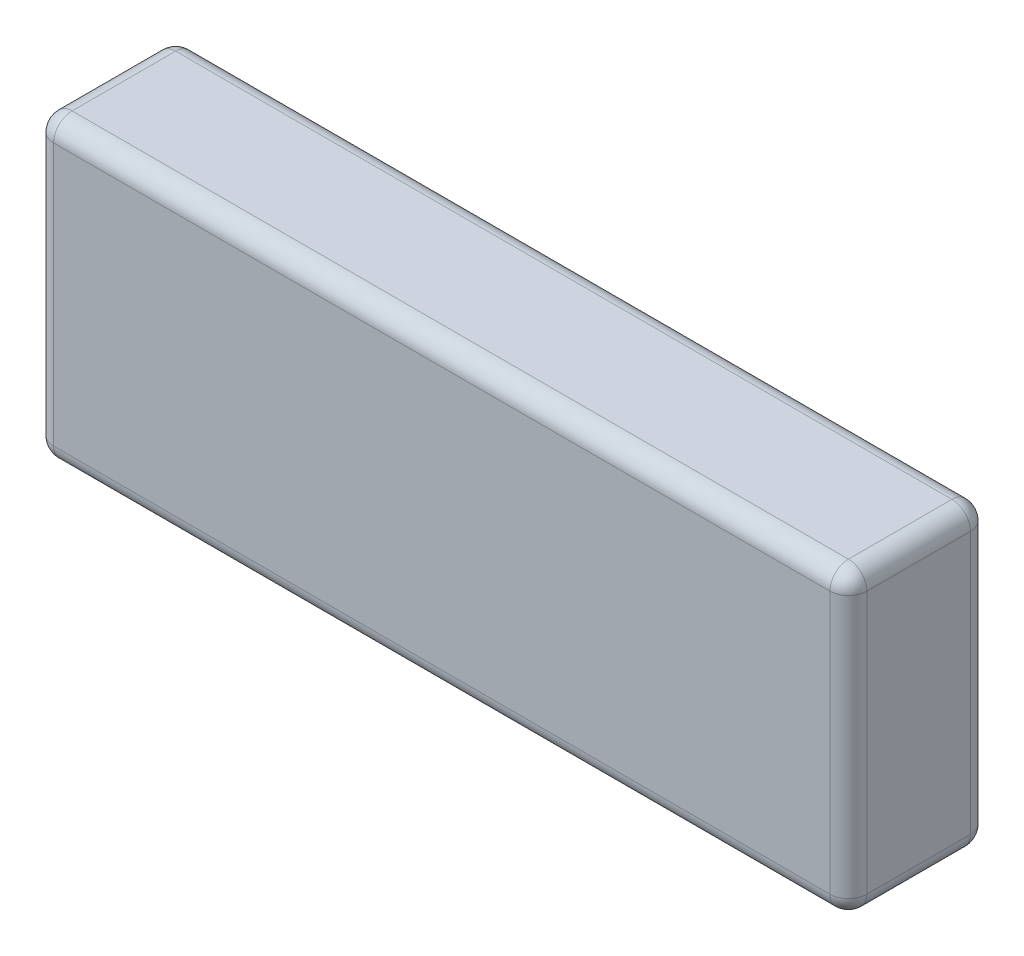
ISO-10303-21;
HEADER;
FILE_DESCRIPTION(('STEP AP214'),'2;1');
FILE_NAME('part.step','',(''),(''),'','','');
FILE_SCHEMA(('AUTOMOTIVE_DESIGN { 1 0 10303 214 1 1 1 1 }'));
ENDSEC;
DATA;
#1=APPLICATION_CONTEXT('core data for automotive mechanical design processes');
#2=APPLICATION_PROTOCOL_DEFINITION('international standard','automotive_design',2000,#1);
#3=PRODUCT_CONTEXT('',#1,'mechanical');
#4=PRODUCT('Part','Part','',(#3));
#5=PRODUCT_RELATED_PRODUCT_CATEGORY('part','',(#4));
#6=PRODUCT_DEFINITION_FORMATION('','',#4);
#7=PRODUCT_DEFINITION_CONTEXT('part definition',#1,'design');
#8=PRODUCT_DEFINITION('design','',#6,#7);
#9=PRODUCT_DEFINITION_SHAPE('','',#8);
#10=(LENGTH_UNIT() NAMED_UNIT(*) SI_UNIT(.MILLI.,.METRE.));
#11=(NAMED_UNIT(*) PLANE_ANGLE_UNIT() SI_UNIT($,.RADIAN.));
#12=(NAMED_UNIT(*) SI_UNIT($,.STERADIAN.) SOLID_ANGLE_UNIT());
#13=UNCERTAINTY_MEASURE_WITH_UNIT(LENGTH_MEASURE(1.E-05),#10,'distance_accuracy_value','');
#14=(GEOMETRIC_REPRESENTATION_CONTEXT(3) GLOBAL_UNCERTAINTY_ASSIGNED_CONTEXT((#13)) GLOBAL_UNIT_ASSIGNED_CONTEXT((#10,
#11,#12)) REPRESENTATION_CONTEXT('',''));
#15=CARTESIAN_POINT('',(0.,0.,0.));
#16=DIRECTION('',(0.,0.,1.));
#17=DIRECTION('',(1.,0.,0.));
#18=AXIS2_PLACEMENT_3D('',#15,#16,#17);
#19=CARTESIAN_POINT('',(0.,0.,3.8));
#20=DIRECTION('',(1.,0.,0.));
#21=DIRECTION('',(0.,0.,-1.));
#22=AXIS2_PLACEMENT_3D('',#19,#20,#21);
#23=PLANE('',#22);
#24=DIRECTION('',(0.,-1.,0.));
#25=VECTOR('',#24,1.);
#26=CARTESIAN_POINT('',(0.,0.,0.5));
#27=LINE('',#26,#25);
#28=CARTESIAN_POINT('',(0.,7.6,0.5));
#29=VERTEX_POINT('',#28);
#30=CARTESIAN_POINT('',(0.,0.5,0.5));
#31=VERTEX_POINT('',#30);
#32=EDGE_CURVE('E167',#29,#31,#27,.T.);
#33=ORIENTED_EDGE('',*,*,#32,.T.);
#34=DIRECTION('',(0.,0.,-1.));
#35=VECTOR('',#34,1.);
#36=CARTESIAN_POINT('',(0.,0.5,3.8));
#37=LINE('',#36,#35);
#38=CARTESIAN_POINT('',(0.,0.5,3.3));
#39=VERTEX_POINT('',#38);
#40=EDGE_CURVE('E169',#31,#39,#37,.F.);
#41=ORIENTED_EDGE('',*,*,#40,.T.);
#42=DIRECTION('',(0.,-1.,0.));
#43=VECTOR('',#42,1.);
#44=CARTESIAN_POINT('',(0.,0.,3.3));
#45=LINE('',#44,#43);
#46=CARTESIAN_POINT('',(0.,7.6,3.3));
#47=VERTEX_POINT('',#46);
#48=EDGE_CURVE('E163',#39,#47,#45,.F.);
#49=ORIENTED_EDGE('',*,*,#48,.T.);
#50=DIRECTION('',(0.,0.,-1.));
#51=VECTOR('',#50,1.);
#52=CARTESIAN_POINT('',(0.,7.6,3.8));
#53=LINE('',#52,#51);
#54=EDGE_CURVE('E165',#47,#29,#53,.T.);
#55=ORIENTED_EDGE('',*,*,#54,.T.);
#56=EDGE_LOOP('',(#33,#41,#49,#55));
#57=FACE_BOUND('',#56,.T.);
#58=ADVANCED_FACE('F32',(#57),#23,.F.);
#59=CARTESIAN_POINT('',(0.,0.,3.8));
#60=DIRECTION('',(0.,1.,0.));
#61=DIRECTION('',(0.,0.,1.));
#62=AXIS2_PLACEMENT_3D('',#59,#60,#61);
#63=PLANE('',#62);
#64=DIRECTION('',(1.,0.,0.));
#65=VECTOR('',#64,1.);
#66=CARTESIAN_POINT('',(0.,0.,3.3));
#67=LINE('',#66,#65);
#68=CARTESIAN_POINT('',(21.5,0.,3.3));
#69=VERTEX_POINT('',#68);
#70=CARTESIAN_POINT('',(0.5,0.,3.3));
#71=VERTEX_POINT('',#70);
#72=EDGE_CURVE('E124',#69,#71,#67,.F.);
#73=ORIENTED_EDGE('',*,*,#72,.T.);
#74=DIRECTION('',(0.,0.,-1.));
#75=VECTOR('',#74,1.);
#76=CARTESIAN_POINT('',(0.5,0.,3.8));
#77=LINE('',#76,#75);
#78=CARTESIAN_POINT('',(0.5,0.,0.5));
#79=VERTEX_POINT('',#78);
#80=EDGE_CURVE('E161',#71,#79,#77,.T.);
#81=ORIENTED_EDGE('',*,*,#80,.T.);
#82=DIRECTION('',(1.,0.,0.));
#83=VECTOR('',#82,1.);
#84=CARTESIAN_POINT('',(22.,0.,0.5));
#85=LINE('',#84,#83);
#86=CARTESIAN_POINT('',(21.5,0.,0.5));
#87=VERTEX_POINT('',#86);
#88=EDGE_CURVE('E127',#79,#87,#85,.T.);
#89=ORIENTED_EDGE('',*,*,#88,.T.);
#90=DIRECTION('',(0.,0.,-1.));
#91=VECTOR('',#90,1.);
#92=CARTESIAN_POINT('',(21.5,0.,3.8));
#93=LINE('',#92,#91);
#94=EDGE_CURVE('E119',#87,#69,#93,.F.);
#95=ORIENTED_EDGE('',*,*,#94,.T.);
#96=EDGE_LOOP('',(#73,#81,#89,#95));
#97=FACE_BOUND('',#96,.T.);
#98=ADVANCED_FACE('F121',(#97),#63,.F.);
#99=CARTESIAN_POINT('',(22.,0.,3.8));
#100=DIRECTION('',(-1.,0.,0.));
#101=DIRECTION('',(0.,0.,1.));
#102=AXIS2_PLACEMENT_3D('',#99,#100,#101);
#103=PLANE('',#102);
#104=DIRECTION('',(0.,1.,0.));
#105=VECTOR('',#104,1.);
#106=CARTESIAN_POINT('',(22.,0.,3.3));
#107=LINE('',#106,#105);
#108=CARTESIAN_POINT('',(22.,7.6,3.3));
#109=VERTEX_POINT('',#108);
#110=CARTESIAN_POINT('',(22.,0.5,3.3));
#111=VERTEX_POINT('',#110);
#112=EDGE_CURVE('E181',#109,#111,#107,.F.);
#113=ORIENTED_EDGE('',*,*,#112,.T.);
#114=DIRECTION('',(0.,0.,-1.));
#115=VECTOR('',#114,1.);
#116=CARTESIAN_POINT('',(22.,0.5,3.8));
#117=LINE('',#116,#115);
#118=CARTESIAN_POINT('',(22.,0.5,0.5));
#119=VERTEX_POINT('',#118);
#120=EDGE_CURVE('E138',#111,#119,#117,.T.);
#121=ORIENTED_EDGE('',*,*,#120,.T.);
#122=DIRECTION('',(0.,1.,0.));
#123=VECTOR('',#122,1.);
#124=CARTESIAN_POINT('',(22.,8.1,0.5));
#125=LINE('',#124,#123);
#126=CARTESIAN_POINT('',(22.,7.6,0.5));
#127=VERTEX_POINT('',#126);
#128=EDGE_CURVE('E185',#119,#127,#125,.T.);
#129=ORIENTED_EDGE('',*,*,#128,.T.);
#130=DIRECTION('',(0.,0.,-1.));
#131=VECTOR('',#130,1.);
#132=CARTESIAN_POINT('',(22.,7.6,3.8));
#133=LINE('',#132,#131);
#134=EDGE_CURVE('E183',#127,#109,#133,.F.);
#135=ORIENTED_EDGE('',*,*,#134,.T.);
#136=EDGE_LOOP('',(#113,#121,#129,#135));
#137=FACE_BOUND('',#136,.T.);
#138=ADVANCED_FACE('F323',(#137),#103,.F.);
#139=CARTESIAN_POINT('',(0.,8.1,3.8));
#140=DIRECTION('',(0.,-1.,0.));
#141=DIRECTION('',(0.,0.,-1.));
#142=AXIS2_PLACEMENT_3D('',#139,#140,#141);
#143=PLANE('',#142);
#144=DIRECTION('',(0.,0.,-1.));
#145=VECTOR('',#144,1.);
#146=CARTESIAN_POINT('',(21.5,8.1,3.8));
#147=LINE('',#146,#145);
#148=CARTESIAN_POINT('',(21.5,8.1,3.3));
#149=VERTEX_POINT('',#148);
#150=CARTESIAN_POINT('',(21.5,8.1,0.5));
#151=VERTEX_POINT('',#150);
#152=EDGE_CURVE('E192',#149,#151,#147,.T.);
#153=ORIENTED_EDGE('',*,*,#152,.T.);
#154=DIRECTION('',(-1.,0.,0.));
#155=VECTOR('',#154,1.);
#156=CARTESIAN_POINT('',(0.,8.1,0.5));
#157=LINE('',#156,#155);
#158=CARTESIAN_POINT('',(0.5,8.1,0.5));
#159=VERTEX_POINT('',#158);
#160=EDGE_CURVE('E195',#151,#159,#157,.T.);
#161=ORIENTED_EDGE('',*,*,#160,.T.);
#162=DIRECTION('',(0.,0.,-1.));
#163=VECTOR('',#162,1.);
#164=CARTESIAN_POINT('',(0.5,8.1,3.8));
#165=LINE('',#164,#163);
#166=CARTESIAN_POINT('',(0.5,8.1,3.3));
#167=VERTEX_POINT('',#166);
#168=EDGE_CURVE('E190',#159,#167,#165,.F.);
#169=ORIENTED_EDGE('',*,*,#168,.T.);
#170=DIRECTION('',(-1.,0.,0.));
#171=VECTOR('',#170,1.);
#172=CARTESIAN_POINT('',(0.,8.1,3.3));
#173=LINE('',#172,#171);
#174=EDGE_CURVE('E188',#167,#149,#173,.F.);
#175=ORIENTED_EDGE('',*,*,#174,.T.);
#176=EDGE_LOOP('',(#153,#161,#169,#175));
#177=FACE_BOUND('',#176,.T.);
#178=ADVANCED_FACE('F272',(#177),#143,.F.);
#179=CARTESIAN_POINT('',(0.,0.,3.8));
#180=DIRECTION('',(0.,0.,-1.));
#181=DIRECTION('',(-1.,0.,0.));
#182=AXIS2_PLACEMENT_3D('',#179,#180,#181);
#183=PLANE('',#182);
#184=DIRECTION('',(0.,1.,0.));
#185=VECTOR('',#184,1.);
#186=CARTESIAN_POINT('',(21.5,0.,3.8));
#187=LINE('',#186,#185);
#188=CARTESIAN_POINT('',(21.5,0.5,3.8));
#189=VERTEX_POINT('',#188);
#190=CARTESIAN_POINT('',(21.5,7.6,3.8));
#191=VERTEX_POINT('',#190);
#192=EDGE_CURVE('E41',#189,#191,#187,.T.);
#193=ORIENTED_EDGE('',*,*,#192,.T.);
#194=DIRECTION('',(-1.,0.,0.));
#195=VECTOR('',#194,1.);
#196=CARTESIAN_POINT('',(0.,7.6,3.8));
#197=LINE('',#196,#195);
#198=CARTESIAN_POINT('',(0.5,7.6,3.8));
#199=VERTEX_POINT('',#198);
#200=EDGE_CURVE('E11',#191,#199,#197,.T.);
#201=ORIENTED_EDGE('',*,*,#200,.T.);
#202=DIRECTION('',(0.,-1.,0.));
#203=VECTOR('',#202,1.);
#204=CARTESIAN_POINT('',(0.5,0.,3.8));
#205=LINE('',#204,#203);
#206=CARTESIAN_POINT('',(0.5,0.5,3.8));
#207=VERTEX_POINT('',#206);
#208=EDGE_CURVE('E197',#199,#207,#205,.T.);
#209=ORIENTED_EDGE('',*,*,#208,.T.);
#210=DIRECTION('',(1.,0.,0.));
#211=VECTOR('',#210,1.);
#212=CARTESIAN_POINT('',(0.,0.5,3.8));
#213=LINE('',#212,#211);
#214=EDGE_CURVE('E52',#207,#189,#213,.T.);
#215=ORIENTED_EDGE('',*,*,#214,.T.);
#216=EDGE_LOOP('',(#193,#201,#209,#215));
#217=FACE_BOUND('',#216,.T.);
#218=ADVANCED_FACE('F287',(#217),#183,.F.);
#219=CARTESIAN_POINT('',(0.,0.,0.));
#220=DIRECTION('',(0.,0.,-1.));
#221=DIRECTION('',(-1.,0.,0.));
#222=AXIS2_PLACEMENT_3D('',#219,#220,#221);
#223=PLANE('',#222);
#224=DIRECTION('',(0.,1.,0.));
#225=VECTOR('',#224,1.);
#226=CARTESIAN_POINT('',(21.5,0.,0.));
#227=LINE('',#226,#225);
#228=CARTESIAN_POINT('',(21.5,7.6,0.));
#229=VERTEX_POINT('',#228);
#230=CARTESIAN_POINT('',(21.5,0.5,0.));
#231=VERTEX_POINT('',#230);
#232=EDGE_CURVE('E174',#229,#231,#227,.F.);
#233=ORIENTED_EDGE('',*,*,#232,.T.);
#234=DIRECTION('',(1.,0.,0.));
#235=VECTOR('',#234,1.);
#236=CARTESIAN_POINT('',(0.,0.5,0.));
#237=LINE('',#236,#235);
#238=CARTESIAN_POINT('',(0.5,0.5,0.));
#239=VERTEX_POINT('',#238);
#240=EDGE_CURVE('E178',#231,#239,#237,.F.);
#241=ORIENTED_EDGE('',*,*,#240,.T.);
#242=DIRECTION('',(0.,-1.,0.));
#243=VECTOR('',#242,1.);
#244=CARTESIAN_POINT('',(0.5,8.1,0.));
#245=LINE('',#244,#243);
#246=CARTESIAN_POINT('',(0.5,7.6,0.));
#247=VERTEX_POINT('',#246);
#248=EDGE_CURVE('E176',#239,#247,#245,.F.);
#249=ORIENTED_EDGE('',*,*,#248,.T.);
#250=DIRECTION('',(-1.,0.,0.));
#251=VECTOR('',#250,1.);
#252=CARTESIAN_POINT('',(22.,7.6,0.));
#253=LINE('',#252,#251);
#254=EDGE_CURVE('E172',#247,#229,#253,.F.);
#255=ORIENTED_EDGE('',*,*,#254,.T.);
#256=EDGE_LOOP('',(#233,#241,#249,#255));
#257=FACE_BOUND('',#256,.T.);
#258=ADVANCED_FACE('F263',(#257),#223,.T.);
#259=CARTESIAN_POINT('',(21.5,7.6,3.8));
#260=DIRECTION('',(0.,0.,-1.));
#261=DIRECTION('',(-1.,0.,0.));
#262=AXIS2_PLACEMENT_3D('',#259,#260,#261);
#263=CYLINDRICAL_SURFACE('',#262,0.5);
#264=CARTESIAN_POINT('',(21.5,7.6,3.3));
#265=DIRECTION('',(0.,0.,1.));
#266=DIRECTION('',(1.,0.,0.));
#267=AXIS2_PLACEMENT_3D('',#264,#265,#266);
#268=CIRCLE('',#267,0.5);
#269=EDGE_CURVE('E36',#109,#149,#268,.T.);
#270=ORIENTED_EDGE('',*,*,#269,.F.);
#271=ORIENTED_EDGE('',*,*,#134,.F.);
#272=CARTESIAN_POINT('',(21.5,7.6,0.5));
#273=DIRECTION('',(0.,0.,-1.));
#274=DIRECTION('',(-1.,0.,0.));
#275=AXIS2_PLACEMENT_3D('',#272,#273,#274);
#276=CIRCLE('',#275,0.5);
#277=EDGE_CURVE('E158',#151,#127,#276,.T.);
#278=ORIENTED_EDGE('',*,*,#277,.F.);
#279=ORIENTED_EDGE('',*,*,#152,.F.);
#280=EDGE_LOOP('',(#270,#271,#278,#279));
#281=FACE_BOUND('',#280,.T.);
#282=ADVANCED_FACE('F34',(#281),#263,.T.);
#283=CARTESIAN_POINT('',(21.5,7.6,3.3));
#284=DIRECTION('',(0.,0.,1.));
#285=DIRECTION('',(1.,0.,0.));
#286=AXIS2_PLACEMENT_3D('',#283,#284,#285);
#287=SPHERICAL_SURFACE('',#286,0.5);
#288=CARTESIAN_POINT('',(21.5,7.6,3.3));
#289=DIRECTION('',(0.,1.,0.));
#290=DIRECTION('',(0.,0.,1.));
#291=AXIS2_PLACEMENT_3D('',#288,#289,#290);
#292=CIRCLE('',#291,0.5);
#293=EDGE_CURVE('E243',#109,#191,#292,.F.);
#294=ORIENTED_EDGE('',*,*,#293,.F.);
#295=ORIENTED_EDGE('',*,*,#269,.T.);
#296=CARTESIAN_POINT('',(21.5,7.6,3.3));
#297=DIRECTION('',(1.,0.,0.));
#298=DIRECTION('',(0.,0.,-1.));
#299=AXIS2_PLACEMENT_3D('',#296,#297,#298);
#300=CIRCLE('',#299,0.5);
#301=EDGE_CURVE('E245',#191,#149,#300,.F.);
#302=ORIENTED_EDGE('',*,*,#301,.F.);
#303=EDGE_LOOP('',(#294,#295,#302));
#304=FACE_BOUND('',#303,.T.);
#305=ADVANCED_FACE('F456',(#304),#287,.T.);
#306=CARTESIAN_POINT('',(21.5,7.6,0.5));
#307=DIRECTION('',(0.,0.,1.));
#308=DIRECTION('',(1.,0.,0.));
#309=AXIS2_PLACEMENT_3D('',#306,#307,#308);
#310=SPHERICAL_SURFACE('',#309,0.5);
#311=CARTESIAN_POINT('',(21.5,7.6,0.5));
#312=DIRECTION('',(1.,0.,0.));
#313=DIRECTION('',(0.,1.,0.));
#314=AXIS2_PLACEMENT_3D('',#311,#312,#313);
#315=CIRCLE('',#314,0.5);
#316=EDGE_CURVE('E237',#151,#229,#315,.F.);
#317=ORIENTED_EDGE('',*,*,#316,.F.);
#318=ORIENTED_EDGE('',*,*,#277,.T.);
#319=CARTESIAN_POINT('',(21.5,7.6,0.5));
#320=DIRECTION('',(0.,1.,0.));
#321=DIRECTION('',(0.,0.,1.));
#322=AXIS2_PLACEMENT_3D('',#319,#320,#321);
#323=CIRCLE('',#322,0.5);
#324=EDGE_CURVE('E240',#229,#127,#323,.F.);
#325=ORIENTED_EDGE('',*,*,#324,.F.);
#326=EDGE_LOOP('',(#317,#318,#325));
#327=FACE_BOUND('',#326,.T.);
#328=ADVANCED_FACE('F252',(#327),#310,.T.);
#329=CARTESIAN_POINT('',(0.,7.6,3.3));
#330=DIRECTION('',(-1.,0.,0.));
#331=DIRECTION('',(0.,0.,1.));
#332=AXIS2_PLACEMENT_3D('',#329,#330,#331);
#333=CYLINDRICAL_SURFACE('',#332,0.5);
#334=ORIENTED_EDGE('',*,*,#301,.T.);
#335=ORIENTED_EDGE('',*,*,#174,.F.);
#336=CARTESIAN_POINT('',(0.5,7.6,3.3));
#337=DIRECTION('',(-1.,0.,0.));
#338=DIRECTION('',(0.,0.,1.));
#339=AXIS2_PLACEMENT_3D('',#336,#337,#338);
#340=CIRCLE('',#339,0.5);
#341=EDGE_CURVE('E231',#199,#167,#340,.T.);
#342=ORIENTED_EDGE('',*,*,#341,.F.);
#343=ORIENTED_EDGE('',*,*,#200,.F.);
#344=EDGE_LOOP('',(#334,#335,#342,#343));
#345=FACE_BOUND('',#344,.T.);
#346=ADVANCED_FACE('F286',(#345),#333,.T.);
#347=CARTESIAN_POINT('',(21.5,0.,3.3));
#348=DIRECTION('',(0.,1.,0.));
#349=DIRECTION('',(0.,0.,1.));
#350=AXIS2_PLACEMENT_3D('',#347,#348,#349);
#351=CYLINDRICAL_SURFACE('',#350,0.5);
#352=ORIENTED_EDGE('',*,*,#293,.T.);
#353=ORIENTED_EDGE('',*,*,#192,.F.);
#354=CARTESIAN_POINT('',(21.5,0.5,3.3));
#355=DIRECTION('',(0.,-1.,0.));
#356=DIRECTION('',(0.,0.,-1.));
#357=AXIS2_PLACEMENT_3D('',#354,#355,#356);
#358=CIRCLE('',#357,0.5);
#359=EDGE_CURVE('E142',#111,#189,#358,.T.);
#360=ORIENTED_EDGE('',*,*,#359,.F.);
#361=ORIENTED_EDGE('',*,*,#112,.F.);
#362=EDGE_LOOP('',(#352,#353,#360,#361));
#363=FACE_BOUND('',#362,.T.);
#364=ADVANCED_FACE('F433',(#363),#351,.T.);
#365=CARTESIAN_POINT('',(21.5,0.5,3.8));
#366=DIRECTION('',(0.,0.,-1.));
#367=DIRECTION('',(-1.,0.,0.));
#368=AXIS2_PLACEMENT_3D('',#365,#366,#367);
#369=CYLINDRICAL_SURFACE('',#368,0.5);
#370=CARTESIAN_POINT('',(21.5,0.5,0.5));
#371=DIRECTION('',(0.,0.,-1.));
#372=DIRECTION('',(-1.,0.,0.));
#373=AXIS2_PLACEMENT_3D('',#370,#371,#372);
#374=CIRCLE('',#373,0.5);
#375=EDGE_CURVE('E143',#119,#87,#374,.T.);
#376=ORIENTED_EDGE('',*,*,#375,.F.);
#377=ORIENTED_EDGE('',*,*,#120,.F.);
#378=CARTESIAN_POINT('',(21.5,0.5,3.3));
#379=DIRECTION('',(0.,0.,1.));
#380=DIRECTION('',(1.,0.,0.));
#381=AXIS2_PLACEMENT_3D('',#378,#379,#380);
#382=CIRCLE('',#381,0.5);
#383=EDGE_CURVE('E134',#69,#111,#382,.T.);
#384=ORIENTED_EDGE('',*,*,#383,.F.);
#385=ORIENTED_EDGE('',*,*,#94,.F.);
#386=EDGE_LOOP('',(#376,#377,#384,#385));
#387=FACE_BOUND('',#386,.T.);
#388=ADVANCED_FACE('F136',(#387),#369,.T.);
#389=CARTESIAN_POINT('',(21.5,0.,0.5));
#390=DIRECTION('',(0.,-1.,0.));
#391=DIRECTION('',(0.,0.,-1.));
#392=AXIS2_PLACEMENT_3D('',#389,#390,#391);
#393=CYLINDRICAL_SURFACE('',#392,0.5);
#394=ORIENTED_EDGE('',*,*,#324,.T.);
#395=ORIENTED_EDGE('',*,*,#128,.F.);
#396=CARTESIAN_POINT('',(21.5,0.5,0.5));
#397=DIRECTION('',(0.,-1.,0.));
#398=DIRECTION('',(1.,0.,0.));
#399=AXIS2_PLACEMENT_3D('',#396,#397,#398);
#400=CIRCLE('',#399,0.5);
#401=EDGE_CURVE('E227',#231,#119,#400,.T.);
#402=ORIENTED_EDGE('',*,*,#401,.F.);
#403=ORIENTED_EDGE('',*,*,#232,.F.);
#404=EDGE_LOOP('',(#394,#395,#402,#403));
#405=FACE_BOUND('',#404,.T.);
#406=ADVANCED_FACE('F259',(#405),#393,.T.);
#407=CARTESIAN_POINT('',(0.,7.6,0.5));
#408=DIRECTION('',(1.,0.,0.));
#409=DIRECTION('',(0.,0.,-1.));
#410=AXIS2_PLACEMENT_3D('',#407,#408,#409);
#411=CYLINDRICAL_SURFACE('',#410,0.5);
#412=ORIENTED_EDGE('',*,*,#316,.T.);
#413=ORIENTED_EDGE('',*,*,#254,.F.);
#414=CARTESIAN_POINT('',(0.5,7.6,0.5));
#415=DIRECTION('',(-1.,0.,0.));
#416=DIRECTION('',(0.,0.,1.));
#417=AXIS2_PLACEMENT_3D('',#414,#415,#416);
#418=CIRCLE('',#417,0.5);
#419=EDGE_CURVE('E224',#159,#247,#418,.T.);
#420=ORIENTED_EDGE('',*,*,#419,.F.);
#421=ORIENTED_EDGE('',*,*,#160,.F.);
#422=EDGE_LOOP('',(#412,#413,#420,#421));
#423=FACE_BOUND('',#422,.T.);
#424=ADVANCED_FACE('F269',(#423),#411,.T.);
#425=CARTESIAN_POINT('',(0.5,7.6,3.8));
#426=DIRECTION('',(0.,0.,-1.));
#427=DIRECTION('',(-1.,0.,0.));
#428=AXIS2_PLACEMENT_3D('',#425,#426,#427);
#429=CYLINDRICAL_SURFACE('',#428,0.5);
#430=CARTESIAN_POINT('',(0.5,7.6,3.3));
#431=DIRECTION('',(0.,0.,1.));
#432=DIRECTION('',(1.,0.,0.));
#433=AXIS2_PLACEMENT_3D('',#430,#431,#432);
#434=CIRCLE('',#433,0.5);
#435=EDGE_CURVE('E234',#167,#47,#434,.T.);
#436=ORIENTED_EDGE('',*,*,#435,.F.);
#437=ORIENTED_EDGE('',*,*,#168,.F.);
#438=CARTESIAN_POINT('',(0.5,7.6,0.5));
#439=DIRECTION('',(0.,0.,-1.));
#440=DIRECTION('',(-1.,0.,0.));
#441=AXIS2_PLACEMENT_3D('',#438,#439,#440);
#442=CIRCLE('',#441,0.5);
#443=EDGE_CURVE('E221',#29,#159,#442,.T.);
#444=ORIENTED_EDGE('',*,*,#443,.F.);
#445=ORIENTED_EDGE('',*,*,#54,.F.);
#446=EDGE_LOOP('',(#436,#437,#444,#445));
#447=FACE_BOUND('',#446,.T.);
#448=ADVANCED_FACE('F277',(#447),#429,.T.);
#449=CARTESIAN_POINT('',(0.5,7.6,3.3));
#450=DIRECTION('',(0.,0.,1.));
#451=DIRECTION('',(1.,0.,0.));
#452=AXIS2_PLACEMENT_3D('',#449,#450,#451);
#453=SPHERICAL_SURFACE('',#452,0.5);
#454=ORIENTED_EDGE('',*,*,#341,.T.);
#455=ORIENTED_EDGE('',*,*,#435,.T.);
#456=CARTESIAN_POINT('',(0.5,7.6,3.3));
#457=DIRECTION('',(0.,1.,0.));
#458=DIRECTION('',(0.,0.,1.));
#459=AXIS2_PLACEMENT_3D('',#456,#457,#458);
#460=CIRCLE('',#459,0.5);
#461=EDGE_CURVE('E149',#199,#47,#460,.F.);
#462=ORIENTED_EDGE('',*,*,#461,.F.);
#463=EDGE_LOOP('',(#454,#455,#462));
#464=FACE_BOUND('',#463,.T.);
#465=ADVANCED_FACE('F283',(#464),#453,.T.);
#466=CARTESIAN_POINT('',(21.5,0.5,3.3));
#467=DIRECTION('',(0.,0.,1.));
#468=DIRECTION('',(1.,0.,0.));
#469=AXIS2_PLACEMENT_3D('',#466,#467,#468);
#470=SPHERICAL_SURFACE('',#469,0.5);
#471=ORIENTED_EDGE('',*,*,#383,.T.);
#472=ORIENTED_EDGE('',*,*,#359,.T.);
#473=CARTESIAN_POINT('',(21.5,0.5,3.3));
#474=DIRECTION('',(1.,0.,0.));
#475=DIRECTION('',(0.,0.,-1.));
#476=AXIS2_PLACEMENT_3D('',#473,#474,#475);
#477=CIRCLE('',#476,0.5);
#478=EDGE_CURVE('E146',#69,#189,#477,.F.);
#479=ORIENTED_EDGE('',*,*,#478,.F.);
#480=EDGE_LOOP('',(#471,#472,#479));
#481=FACE_BOUND('',#480,.T.);
#482=ADVANCED_FACE('F147',(#481),#470,.T.);
#483=CARTESIAN_POINT('',(21.5,0.5,0.5));
#484=DIRECTION('',(0.,0.,1.));
#485=DIRECTION('',(1.,0.,0.));
#486=AXIS2_PLACEMENT_3D('',#483,#484,#485);
#487=SPHERICAL_SURFACE('',#486,0.5);
#488=ORIENTED_EDGE('',*,*,#401,.T.);
#489=ORIENTED_EDGE('',*,*,#375,.T.);
#490=CARTESIAN_POINT('',(21.5,0.5,0.5));
#491=DIRECTION('',(1.,0.,0.));
#492=DIRECTION('',(0.,0.,-1.));
#493=AXIS2_PLACEMENT_3D('',#490,#491,#492);
#494=CIRCLE('',#493,0.5);
#495=EDGE_CURVE('E150',#231,#87,#494,.F.);
#496=ORIENTED_EDGE('',*,*,#495,.F.);
#497=EDGE_LOOP('',(#488,#489,#496));
#498=FACE_BOUND('',#497,.T.);
#499=ADVANCED_FACE('F306',(#498),#487,.T.);
#500=CARTESIAN_POINT('',(0.5,7.6,0.5));
#501=DIRECTION('',(0.,0.,1.));
#502=DIRECTION('',(1.,0.,0.));
#503=AXIS2_PLACEMENT_3D('',#500,#501,#502);
#504=SPHERICAL_SURFACE('',#503,0.5);
#505=ORIENTED_EDGE('',*,*,#443,.T.);
#506=ORIENTED_EDGE('',*,*,#419,.T.);
#507=CARTESIAN_POINT('',(0.5,7.6,0.5));
#508=DIRECTION('',(0.,1.,0.));
#509=DIRECTION('',(0.,0.,1.));
#510=AXIS2_PLACEMENT_3D('',#507,#508,#509);
#511=CIRCLE('',#510,0.5);
#512=EDGE_CURVE('E214',#29,#247,#511,.F.);
#513=ORIENTED_EDGE('',*,*,#512,.F.);
#514=EDGE_LOOP('',(#505,#506,#513));
#515=FACE_BOUND('',#514,.T.);
#516=ADVANCED_FACE('F308',(#515),#504,.T.);
#517=CARTESIAN_POINT('',(0.5,0.,3.3));
#518=DIRECTION('',(0.,-1.,0.));
#519=DIRECTION('',(0.,0.,-1.));
#520=AXIS2_PLACEMENT_3D('',#517,#518,#519);
#521=CYLINDRICAL_SURFACE('',#520,0.5);
#522=ORIENTED_EDGE('',*,*,#461,.T.);
#523=ORIENTED_EDGE('',*,*,#48,.F.);
#524=CARTESIAN_POINT('',(0.5,0.5,3.3));
#525=DIRECTION('',(0.,-1.,0.));
#526=DIRECTION('',(0.,0.,-1.));
#527=AXIS2_PLACEMENT_3D('',#524,#525,#526);
#528=CIRCLE('',#527,0.5);
#529=EDGE_CURVE('E211',#207,#39,#528,.T.);
#530=ORIENTED_EDGE('',*,*,#529,.F.);
#531=ORIENTED_EDGE('',*,*,#208,.F.);
#532=EDGE_LOOP('',(#522,#523,#530,#531));
#533=FACE_BOUND('',#532,.T.);
#534=ADVANCED_FACE('F291',(#533),#521,.T.);
#535=CARTESIAN_POINT('',(0.,0.5,3.3));
#536=DIRECTION('',(1.,0.,0.));
#537=DIRECTION('',(0.,0.,-1.));
#538=AXIS2_PLACEMENT_3D('',#535,#536,#537);
#539=CYLINDRICAL_SURFACE('',#538,0.5);
#540=ORIENTED_EDGE('',*,*,#478,.T.);
#541=ORIENTED_EDGE('',*,*,#214,.F.);
#542=CARTESIAN_POINT('',(0.5,0.5,3.3));
#543=DIRECTION('',(-1.,0.,0.));
#544=DIRECTION('',(0.,0.,1.));
#545=AXIS2_PLACEMENT_3D('',#542,#543,#544);
#546=CIRCLE('',#545,0.5);
#547=EDGE_CURVE('E154',#71,#207,#546,.T.);
#548=ORIENTED_EDGE('',*,*,#547,.F.);
#549=ORIENTED_EDGE('',*,*,#72,.F.);
#550=EDGE_LOOP('',(#540,#541,#548,#549));
#551=FACE_BOUND('',#550,.T.);
#552=ADVANCED_FACE('F152',(#551),#539,.T.);
#553=CARTESIAN_POINT('',(0.,0.5,0.5));
#554=DIRECTION('',(-1.,0.,0.));
#555=DIRECTION('',(0.,0.,1.));
#556=AXIS2_PLACEMENT_3D('',#553,#554,#555);
#557=CYLINDRICAL_SURFACE('',#556,0.5);
#558=ORIENTED_EDGE('',*,*,#495,.T.);
#559=ORIENTED_EDGE('',*,*,#88,.F.);
#560=CARTESIAN_POINT('',(0.5,0.5,0.5));
#561=DIRECTION('',(-1.,0.,0.));
#562=DIRECTION('',(0.,-1.,0.));
#563=AXIS2_PLACEMENT_3D('',#560,#561,#562);
#564=CIRCLE('',#563,0.5);
#565=EDGE_CURVE('E207',#239,#79,#564,.T.);
#566=ORIENTED_EDGE('',*,*,#565,.F.);
#567=ORIENTED_EDGE('',*,*,#240,.F.);
#568=EDGE_LOOP('',(#558,#559,#566,#567));
#569=FACE_BOUND('',#568,.T.);
#570=ADVANCED_FACE('F304',(#569),#557,.T.);
#571=CARTESIAN_POINT('',(0.5,0.,0.5));
#572=DIRECTION('',(0.,1.,0.));
#573=DIRECTION('',(0.,0.,1.));
#574=AXIS2_PLACEMENT_3D('',#571,#572,#573);
#575=CYLINDRICAL_SURFACE('',#574,0.5);
#576=ORIENTED_EDGE('',*,*,#512,.T.);
#577=ORIENTED_EDGE('',*,*,#248,.F.);
#578=CARTESIAN_POINT('',(0.5,0.5,0.5));
#579=DIRECTION('',(0.,-1.,0.));
#580=DIRECTION('',(0.,0.,-1.));
#581=AXIS2_PLACEMENT_3D('',#578,#579,#580);
#582=CIRCLE('',#581,0.5);
#583=EDGE_CURVE('E205',#31,#239,#582,.T.);
#584=ORIENTED_EDGE('',*,*,#583,.F.);
#585=ORIENTED_EDGE('',*,*,#32,.F.);
#586=EDGE_LOOP('',(#576,#577,#584,#585));
#587=FACE_BOUND('',#586,.T.);
#588=ADVANCED_FACE('F333',(#587),#575,.T.);
#589=CARTESIAN_POINT('',(0.5,0.5,3.3));
#590=DIRECTION('',(0.,0.,1.));
#591=DIRECTION('',(1.,0.,0.));
#592=AXIS2_PLACEMENT_3D('',#589,#590,#591);
#593=SPHERICAL_SURFACE('',#592,0.5);
#594=ORIENTED_EDGE('',*,*,#547,.T.);
#595=ORIENTED_EDGE('',*,*,#529,.T.);
#596=CARTESIAN_POINT('',(0.5,0.5,3.3));
#597=DIRECTION('',(0.,0.,1.));
#598=DIRECTION('',(1.,0.,0.));
#599=AXIS2_PLACEMENT_3D('',#596,#597,#598);
#600=CIRCLE('',#599,0.5);
#601=EDGE_CURVE('E203',#71,#39,#600,.F.);
#602=ORIENTED_EDGE('',*,*,#601,.F.);
#603=EDGE_LOOP('',(#594,#595,#602));
#604=FACE_BOUND('',#603,.T.);
#605=ADVANCED_FACE('F293',(#604),#593,.T.);
#606=CARTESIAN_POINT('',(0.5,0.5,0.5));
#607=DIRECTION('',(0.,0.,1.));
#608=DIRECTION('',(1.,0.,0.));
#609=AXIS2_PLACEMENT_3D('',#606,#607,#608);
#610=SPHERICAL_SURFACE('',#609,0.5);
#611=ORIENTED_EDGE('',*,*,#583,.T.);
#612=ORIENTED_EDGE('',*,*,#565,.T.);
#613=CARTESIAN_POINT('',(0.5,0.5,0.5));
#614=DIRECTION('',(0.,0.,-1.));
#615=DIRECTION('',(-1.,0.,0.));
#616=AXIS2_PLACEMENT_3D('',#613,#614,#615);
#617=CIRCLE('',#616,0.5);
#618=EDGE_CURVE('E201',#31,#79,#617,.F.);
#619=ORIENTED_EDGE('',*,*,#618,.F.);
#620=EDGE_LOOP('',(#611,#612,#619));
#621=FACE_BOUND('',#620,.T.);
#622=ADVANCED_FACE('F301',(#621),#610,.T.);
#623=CARTESIAN_POINT('',(0.5,0.5,3.8));
#624=DIRECTION('',(0.,0.,-1.));
#625=DIRECTION('',(-1.,0.,0.));
#626=AXIS2_PLACEMENT_3D('',#623,#624,#625);
#627=CYLINDRICAL_SURFACE('',#626,0.5);
#628=ORIENTED_EDGE('',*,*,#601,.T.);
#629=ORIENTED_EDGE('',*,*,#40,.F.);
#630=ORIENTED_EDGE('',*,*,#618,.T.);
#631=ORIENTED_EDGE('',*,*,#80,.F.);
#632=EDGE_LOOP('',(#628,#629,#630,#631));
#633=FACE_BOUND('',#632,.T.);
#634=ADVANCED_FACE('F297',(#633),#627,.T.);
#635=CLOSED_SHELL('',(#58,#98,#138,#178,#218,#258,#282,#305,#328,#346,#364,#388,#406,#424,#448,
#465,#482,#499,#516,#534,#552,#570,#588,#605,#622,#634));
#636=MANIFOLD_SOLID_BREP('B2',#635);
#637=ADVANCED_BREP_SHAPE_REPRESENTATION('',(#18,#636),#14);
#638=SHAPE_DEFINITION_REPRESENTATION(#9,#637);
ENDSEC;
END-ISO-10303-21;
